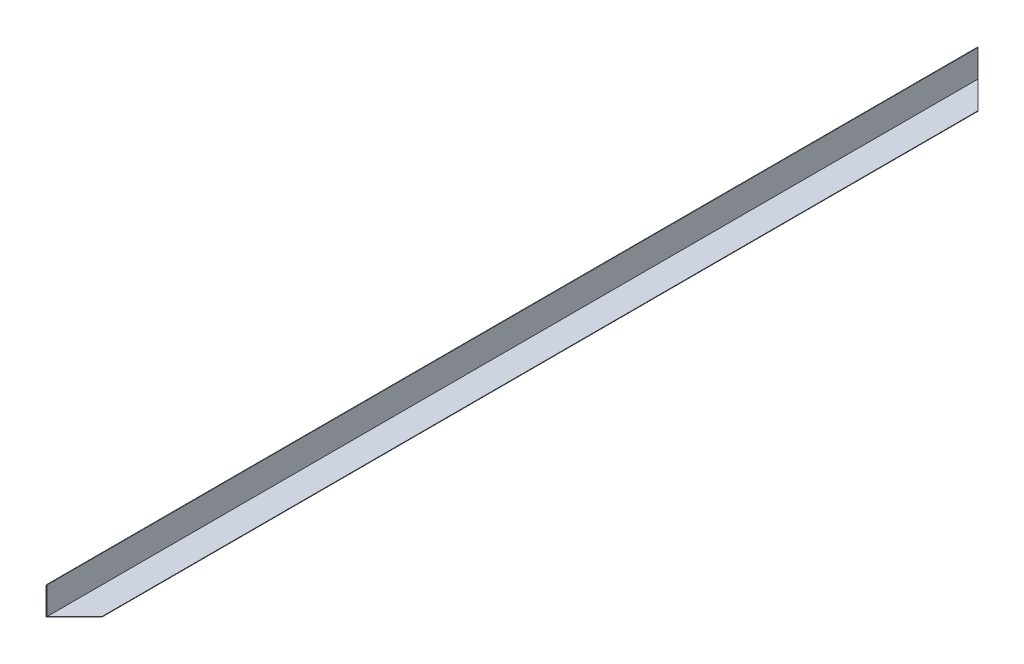
ISO-10303-21;
HEADER;
FILE_DESCRIPTION(('STEP AP214'),'2;1');
FILE_NAME('part.step','',(''),(''),'','','');
FILE_SCHEMA(('AUTOMOTIVE_DESIGN { 1 0 10303 214 1 1 1 1 }'));
ENDSEC;
DATA;
#1=APPLICATION_CONTEXT('core data for automotive mechanical design processes');
#2=APPLICATION_PROTOCOL_DEFINITION('international standard','automotive_design',2000,#1);
#3=PRODUCT_CONTEXT('',#1,'mechanical');
#4=PRODUCT('Part','Part','',(#3));
#5=PRODUCT_RELATED_PRODUCT_CATEGORY('part','',(#4));
#6=PRODUCT_DEFINITION_FORMATION('','',#4);
#7=PRODUCT_DEFINITION_CONTEXT('part definition',#1,'design');
#8=PRODUCT_DEFINITION('design','',#6,#7);
#9=PRODUCT_DEFINITION_SHAPE('','',#8);
#10=(LENGTH_UNIT() NAMED_UNIT(*) SI_UNIT(.MILLI.,.METRE.));
#11=(NAMED_UNIT(*) PLANE_ANGLE_UNIT() SI_UNIT($,.RADIAN.));
#12=(NAMED_UNIT(*) SI_UNIT($,.STERADIAN.) SOLID_ANGLE_UNIT());
#13=UNCERTAINTY_MEASURE_WITH_UNIT(LENGTH_MEASURE(1.E-05),#10,'distance_accuracy_value','');
#14=(GEOMETRIC_REPRESENTATION_CONTEXT(3) GLOBAL_UNCERTAINTY_ASSIGNED_CONTEXT((#13)) GLOBAL_UNIT_ASSIGNED_CONTEXT((#10,
#11,#12)) REPRESENTATION_CONTEXT('',''));
#15=CARTESIAN_POINT('',(0.,0.,0.));
#16=DIRECTION('',(0.,0.,1.));
#17=DIRECTION('',(1.,0.,0.));
#18=AXIS2_PLACEMENT_3D('',#15,#16,#17);
#19=CARTESIAN_POINT('',(0.833333333333333,45.,755.));
#20=DIRECTION('',(0.,-1.,0.));
#21=DIRECTION('',(0.,0.,-1.));
#22=AXIS2_PLACEMENT_3D('',#19,#20,#21);
#23=PLANE('',#22);
#24=DIRECTION('',(-0.707106781186548,0.,0.707106781186547));
#25=VECTOR('',#24,1.);
#26=CARTESIAN_POINT('',(-1.66666666666671,45.,752.5));
#27=LINE('',#26,#25);
#28=CARTESIAN_POINT('',(0.833333333333333,45.,750.));
#29=VERTEX_POINT('',#28);
#30=CARTESIAN_POINT('',(0.,45.,750.833333333333));
#31=VERTEX_POINT('',#30);
#32=EDGE_CURVE('E101',#29,#31,#27,.T.);
#33=ORIENTED_EDGE('',*,*,#32,.F.);
#34=DIRECTION('',(0.,0.,-1.));
#35=VECTOR('',#34,1.);
#36=CARTESIAN_POINT('',(0.833333333333333,45.,755.));
#37=LINE('',#36,#35);
#38=CARTESIAN_POINT('',(0.833333333333333,45.,-750.));
#39=VERTEX_POINT('',#38);
#40=EDGE_CURVE('E89',#29,#39,#37,.T.);
#41=ORIENTED_EDGE('',*,*,#40,.T.);
#42=DIRECTION('',(-0.707106781186548,0.,-0.707106781186547));
#43=VECTOR('',#42,1.);
#44=CARTESIAN_POINT('',(753.333333333333,45.,2.49999999999839));
#45=LINE('',#44,#43);
#46=CARTESIAN_POINT('',(0.,45.,-750.833333333333));
#47=VERTEX_POINT('',#46);
#48=EDGE_CURVE('E98',#39,#47,#45,.T.);
#49=ORIENTED_EDGE('',*,*,#48,.T.);
#50=DIRECTION('',(0.,0.,-1.));
#51=VECTOR('',#50,1.);
#52=CARTESIAN_POINT('',(0.,45.,755.));
#53=LINE('',#52,#51);
#54=EDGE_CURVE('E102',#31,#47,#53,.T.);
#55=ORIENTED_EDGE('',*,*,#54,.F.);
#56=EDGE_LOOP('',(#33,#41,#49,#55));
#57=FACE_BOUND('',#56,.T.);
#58=ADVANCED_FACE('F37',(#57),#23,.F.);
#59=CARTESIAN_POINT('',(0.,45.,755.));
#60=DIRECTION('',(1.,0.,0.));
#61=DIRECTION('',(0.,0.,-1.));
#62=AXIS2_PLACEMENT_3D('',#59,#60,#61);
#63=PLANE('',#62);
#64=DIRECTION('',(0.,-1.,0.));
#65=VECTOR('',#64,1.);
#66=CARTESIAN_POINT('',(0.,45.,750.833333333333));
#67=LINE('',#66,#65);
#68=CARTESIAN_POINT('',(0.,0.,750.833333333333));
#69=VERTEX_POINT('',#68);
#70=EDGE_CURVE('E51',#31,#69,#67,.T.);
#71=ORIENTED_EDGE('',*,*,#70,.F.);
#72=ORIENTED_EDGE('',*,*,#54,.T.);
#73=DIRECTION('',(0.,-1.,0.));
#74=VECTOR('',#73,1.);
#75=CARTESIAN_POINT('',(0.,45.,-750.833333333333));
#76=LINE('',#75,#74);
#77=CARTESIAN_POINT('',(0.,0.,-750.833333333333));
#78=VERTEX_POINT('',#77);
#79=EDGE_CURVE('E126',#47,#78,#76,.T.);
#80=ORIENTED_EDGE('',*,*,#79,.T.);
#81=DIRECTION('',(0.,0.,-1.));
#82=VECTOR('',#81,1.);
#83=CARTESIAN_POINT('',(0.,0.,755.));
#84=LINE('',#83,#82);
#85=EDGE_CURVE('E135',#69,#78,#84,.T.);
#86=ORIENTED_EDGE('',*,*,#85,.F.);
#87=EDGE_LOOP('',(#71,#72,#80,#86));
#88=FACE_BOUND('',#87,.T.);
#89=ADVANCED_FACE('F138',(#88),#63,.F.);
#90=CARTESIAN_POINT('',(0.,0.,755.));
#91=DIRECTION('',(0.,1.,0.));
#92=DIRECTION('',(0.,0.,1.));
#93=AXIS2_PLACEMENT_3D('',#90,#91,#92);
#94=PLANE('',#93);
#95=DIRECTION('',(0.707106781186548,0.,-0.707106781186547));
#96=VECTOR('',#95,1.);
#97=CARTESIAN_POINT('',(-2.08333333333339,0.,752.916666666667));
#98=LINE('',#97,#96);
#99=CARTESIAN_POINT('',(45.,0.,705.833333333333));
#100=VERTEX_POINT('',#99);
#101=EDGE_CURVE('E59',#69,#100,#98,.T.);
#102=ORIENTED_EDGE('',*,*,#101,.F.);
#103=ORIENTED_EDGE('',*,*,#85,.T.);
#104=DIRECTION('',(0.707106781186548,0.,0.707106781186547));
#105=VECTOR('',#104,1.);
#106=CARTESIAN_POINT('',(752.916666666667,0.,2.08333333333177));
#107=LINE('',#106,#105);
#108=CARTESIAN_POINT('',(45.,0.,-705.833333333333));
#109=VERTEX_POINT('',#108);
#110=EDGE_CURVE('E123',#78,#109,#107,.T.);
#111=ORIENTED_EDGE('',*,*,#110,.T.);
#112=DIRECTION('',(0.,0.,-1.));
#113=VECTOR('',#112,1.);
#114=CARTESIAN_POINT('',(45.,0.,755.));
#115=LINE('',#114,#113);
#116=EDGE_CURVE('E133',#100,#109,#115,.T.);
#117=ORIENTED_EDGE('',*,*,#116,.F.);
#118=EDGE_LOOP('',(#102,#103,#111,#117));
#119=FACE_BOUND('',#118,.T.);
#120=ADVANCED_FACE('F144',(#119),#94,.F.);
#121=CARTESIAN_POINT('',(45.,0.,755.));
#122=DIRECTION('',(-1.,0.,0.));
#123=DIRECTION('',(0.,0.,1.));
#124=AXIS2_PLACEMENT_3D('',#121,#122,#123);
#125=PLANE('',#124);
#126=DIRECTION('',(0.,1.,0.));
#127=VECTOR('',#126,1.);
#128=CARTESIAN_POINT('',(45.,0.,705.833333333333));
#129=LINE('',#128,#127);
#130=CARTESIAN_POINT('',(45.,0.833333333333333,705.833333333333));
#131=VERTEX_POINT('',#130);
#132=EDGE_CURVE('E110',#100,#131,#129,.T.);
#133=ORIENTED_EDGE('',*,*,#132,.F.);
#134=ORIENTED_EDGE('',*,*,#116,.T.);
#135=DIRECTION('',(0.,1.,0.));
#136=VECTOR('',#135,1.);
#137=CARTESIAN_POINT('',(45.,0.,-705.833333333333));
#138=LINE('',#137,#136);
#139=CARTESIAN_POINT('',(44.9999999999998,0.833333333333333,-705.833333333334));
#140=VERTEX_POINT('',#139);
#141=EDGE_CURVE('E120',#109,#140,#138,.T.);
#142=ORIENTED_EDGE('',*,*,#141,.T.);
#143=DIRECTION('',(0.,0.,-1.));
#144=VECTOR('',#143,1.);
#145=CARTESIAN_POINT('',(45.,0.833333333333333,755.));
#146=LINE('',#145,#144);
#147=EDGE_CURVE('E131',#131,#140,#146,.T.);
#148=ORIENTED_EDGE('',*,*,#147,.F.);
#149=EDGE_LOOP('',(#133,#134,#142,#148));
#150=FACE_BOUND('',#149,.T.);
#151=ADVANCED_FACE('F146',(#150),#125,.F.);
#152=CARTESIAN_POINT('',(45.,0.833333333333333,755.));
#153=DIRECTION('',(0.,-1.,0.));
#154=DIRECTION('',(1.,0.,0.));
#155=AXIS2_PLACEMENT_3D('',#152,#153,#154);
#156=PLANE('',#155);
#157=DIRECTION('',(-0.707106781186548,0.,0.707106781186547));
#158=VECTOR('',#157,1.);
#159=CARTESIAN_POINT('',(20.4166666666667,0.83333333333333,730.416666666667));
#160=LINE('',#159,#158);
#161=CARTESIAN_POINT('',(0.833333333333332,0.833333333333327,750.));
#162=VERTEX_POINT('',#161);
#163=EDGE_CURVE('E109',#131,#162,#160,.T.);
#164=ORIENTED_EDGE('',*,*,#163,.F.);
#165=ORIENTED_EDGE('',*,*,#147,.T.);
#166=DIRECTION('',(-0.707106781186548,0.,-0.707106781186547));
#167=VECTOR('',#166,1.);
#168=CARTESIAN_POINT('',(775.416666666667,0.833333333333434,24.5833333333317));
#169=LINE('',#168,#167);
#170=CARTESIAN_POINT('',(0.833333333333332,0.833333333333327,-750.));
#171=VERTEX_POINT('',#170);
#172=EDGE_CURVE('E104',#140,#171,#169,.T.);
#173=ORIENTED_EDGE('',*,*,#172,.T.);
#174=DIRECTION('',(0.,0.,-1.));
#175=VECTOR('',#174,1.);
#176=CARTESIAN_POINT('',(0.833333333333332,0.833333333333327,755.));
#177=LINE('',#176,#175);
#178=EDGE_CURVE('E97',#162,#171,#177,.T.);
#179=ORIENTED_EDGE('',*,*,#178,.F.);
#180=EDGE_LOOP('',(#164,#165,#173,#179));
#181=FACE_BOUND('',#180,.T.);
#182=ADVANCED_FACE('F147',(#181),#156,.F.);
#183=CARTESIAN_POINT('',(0.833333333333332,0.833333333333327,755.));
#184=DIRECTION('',(-1.,0.,0.));
#185=DIRECTION('',(0.,-1.,0.));
#186=AXIS2_PLACEMENT_3D('',#183,#184,#185);
#187=PLANE('',#186);
#188=DIRECTION('',(0.,1.,0.));
#189=VECTOR('',#188,1.);
#190=CARTESIAN_POINT('',(0.833333333333332,0.833333333333327,750.));
#191=LINE('',#190,#189);
#192=EDGE_CURVE('E12',#162,#29,#191,.T.);
#193=ORIENTED_EDGE('',*,*,#192,.F.);
#194=ORIENTED_EDGE('',*,*,#178,.T.);
#195=DIRECTION('',(0.,1.,0.));
#196=VECTOR('',#195,1.);
#197=CARTESIAN_POINT('',(0.833333333333332,0.833333333333387,-750.));
#198=LINE('',#197,#196);
#199=EDGE_CURVE('E44',#171,#39,#198,.T.);
#200=ORIENTED_EDGE('',*,*,#199,.T.);
#201=ORIENTED_EDGE('',*,*,#40,.F.);
#202=EDGE_LOOP('',(#193,#194,#200,#201));
#203=FACE_BOUND('',#202,.T.);
#204=ADVANCED_FACE('F91',(#203),#187,.F.);
#205=CARTESIAN_POINT('',(375.416666666667,0.,-375.416666666667));
#206=DIRECTION('',(-0.707106781186547,0.,0.707106781186548));
#207=DIRECTION('',(0.707106781186548,0.,0.707106781186547));
#208=AXIS2_PLACEMENT_3D('',#205,#206,#207);
#209=PLANE('',#208);
#210=ORIENTED_EDGE('',*,*,#48,.F.);
#211=ORIENTED_EDGE('',*,*,#199,.F.);
#212=ORIENTED_EDGE('',*,*,#172,.F.);
#213=ORIENTED_EDGE('',*,*,#141,.F.);
#214=ORIENTED_EDGE('',*,*,#110,.F.);
#215=ORIENTED_EDGE('',*,*,#79,.F.);
#216=EDGE_LOOP('',(#210,#211,#212,#213,#214,#215));
#217=FACE_BOUND('',#216,.T.);
#218=ADVANCED_FACE('F141',(#217),#209,.F.);
#219=CARTESIAN_POINT('',(375.416666666667,0.,375.416666666667));
#220=DIRECTION('',(0.707106781186547,0.,0.707106781186548));
#221=DIRECTION('',(0.707106781186548,0.,-0.707106781186547));
#222=AXIS2_PLACEMENT_3D('',#219,#220,#221);
#223=PLANE('',#222);
#224=ORIENTED_EDGE('',*,*,#192,.T.);
#225=ORIENTED_EDGE('',*,*,#32,.T.);
#226=ORIENTED_EDGE('',*,*,#70,.T.);
#227=ORIENTED_EDGE('',*,*,#101,.T.);
#228=ORIENTED_EDGE('',*,*,#132,.T.);
#229=ORIENTED_EDGE('',*,*,#163,.T.);
#230=EDGE_LOOP('',(#224,#225,#226,#227,#228,#229));
#231=FACE_BOUND('',#230,.T.);
#232=ADVANCED_FACE('F107',(#231),#223,.T.);
#233=CLOSED_SHELL('',(#58,#89,#120,#151,#182,#204,#218,#232));
#234=MANIFOLD_SOLID_BREP('B2',#233);
#235=ADVANCED_BREP_SHAPE_REPRESENTATION('',(#18,#234),#14);
#236=SHAPE_DEFINITION_REPRESENTATION(#9,#235);
ENDSEC;
END-ISO-10303-21;
